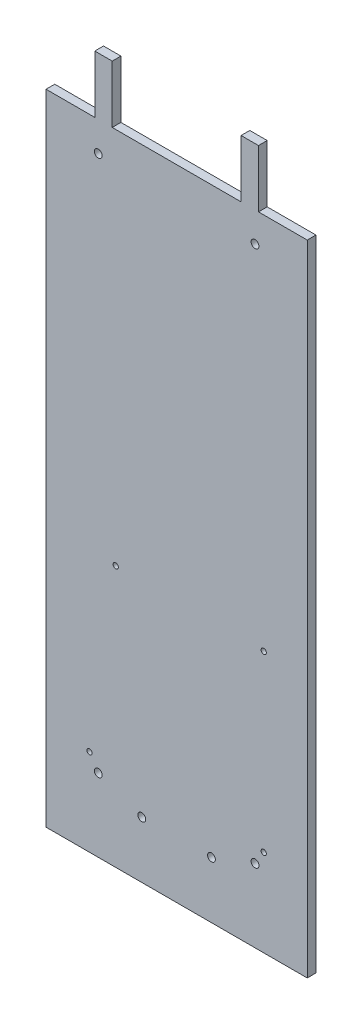
ISO-10303-21;
HEADER;
FILE_DESCRIPTION(('STEP AP214'),'2;1');
FILE_NAME('part.step','',(''),(''),'','','');
FILE_SCHEMA(('AUTOMOTIVE_DESIGN { 1 0 10303 214 1 1 1 1 }'));
ENDSEC;
DATA;
#1=APPLICATION_CONTEXT('core data for automotive mechanical design processes');
#2=APPLICATION_PROTOCOL_DEFINITION('international standard','automotive_design',2000,#1);
#3=PRODUCT_CONTEXT('',#1,'mechanical');
#4=PRODUCT('Part','Part','',(#3));
#5=PRODUCT_RELATED_PRODUCT_CATEGORY('part','',(#4));
#6=PRODUCT_DEFINITION_FORMATION('','',#4);
#7=PRODUCT_DEFINITION_CONTEXT('part definition',#1,'design');
#8=PRODUCT_DEFINITION('design','',#6,#7);
#9=PRODUCT_DEFINITION_SHAPE('','',#8);
#10=(LENGTH_UNIT() NAMED_UNIT(*) SI_UNIT(.MILLI.,.METRE.));
#11=(NAMED_UNIT(*) PLANE_ANGLE_UNIT() SI_UNIT($,.RADIAN.));
#12=(NAMED_UNIT(*) SI_UNIT($,.STERADIAN.) SOLID_ANGLE_UNIT());
#13=UNCERTAINTY_MEASURE_WITH_UNIT(LENGTH_MEASURE(1.E-05),#10,'distance_accuracy_value','');
#14=(GEOMETRIC_REPRESENTATION_CONTEXT(3) GLOBAL_UNCERTAINTY_ASSIGNED_CONTEXT((#13)) GLOBAL_UNIT_ASSIGNED_CONTEXT((#10,
#11,#12)) REPRESENTATION_CONTEXT('',''));
#15=CARTESIAN_POINT('',(0.,0.,0.));
#16=DIRECTION('',(0.,0.,1.));
#17=DIRECTION('',(1.,0.,0.));
#18=AXIS2_PLACEMENT_3D('',#15,#16,#17);
#19=CARTESIAN_POINT('',(0.,0.,5.));
#20=DIRECTION('',(0.,0.,1.));
#21=DIRECTION('',(1.,0.,0.));
#22=AXIS2_PLACEMENT_3D('',#19,#20,#21);
#23=PLANE('',#22);
#24=CARTESIAN_POINT('',(55.,32.5,5.));
#25=DIRECTION('',(0.,0.,1.));
#26=DIRECTION('',(1.,0.,0.));
#27=AXIS2_PLACEMENT_3D('',#24,#25,#26);
#28=CIRCLE('',#27,2.25);
#29=CARTESIAN_POINT('',(57.25,32.5,5.));
#30=VERTEX_POINT('',#29);
#31=EDGE_CURVE('E321',#30,#30,#28,.T.);
#32=ORIENTED_EDGE('',*,*,#31,.F.);
#33=EDGE_LOOP('',(#32));
#34=FACE_BOUND('',#33,.T.);
#35=CARTESIAN_POINT('',(40.,150.,5.));
#36=DIRECTION('',(0.,0.,1.));
#37=DIRECTION('',(1.,0.,0.));
#38=AXIS2_PLACEMENT_3D('',#35,#36,#37);
#39=CIRCLE('',#38,1.5);
#40=CARTESIAN_POINT('',(41.5,150.,5.));
#41=VERTEX_POINT('',#40);
#42=EDGE_CURVE('E333',#41,#41,#39,.T.);
#43=ORIENTED_EDGE('',*,*,#42,.F.);
#44=EDGE_LOOP('',(#43));
#45=FACE_BOUND('',#44,.T.);
#46=CARTESIAN_POINT('',(30.,350.,5.));
#47=DIRECTION('',(0.,0.,1.));
#48=DIRECTION('',(1.,0.,0.));
#49=AXIS2_PLACEMENT_3D('',#46,#47,#48);
#50=CIRCLE('',#49,2.25000000000002);
#51=CARTESIAN_POINT('',(32.25,350.,5.));
#52=VERTEX_POINT('',#51);
#53=EDGE_CURVE('E345',#52,#52,#50,.T.);
#54=ORIENTED_EDGE('',*,*,#53,.F.);
#55=EDGE_LOOP('',(#54));
#56=FACE_BOUND('',#55,.T.);
#57=CARTESIAN_POINT('',(25.,50.,5.));
#58=DIRECTION('',(0.,0.,1.));
#59=DIRECTION('',(1.,0.,0.));
#60=AXIS2_PLACEMENT_3D('',#57,#58,#59);
#61=CIRCLE('',#60,1.5);
#62=CARTESIAN_POINT('',(26.5,50.,5.));
#63=VERTEX_POINT('',#62);
#64=EDGE_CURVE('E357',#63,#63,#61,.T.);
#65=ORIENTED_EDGE('',*,*,#64,.F.);
#66=EDGE_LOOP('',(#65));
#67=FACE_BOUND('',#66,.T.);
#68=CARTESIAN_POINT('',(30.,42.,5.));
#69=DIRECTION('',(0.,0.,1.));
#70=DIRECTION('',(1.,0.,0.));
#71=AXIS2_PLACEMENT_3D('',#68,#69,#70);
#72=CIRCLE('',#71,2.25000000000002);
#73=CARTESIAN_POINT('',(32.2500000000001,42.,5.));
#74=VERTEX_POINT('',#73);
#75=EDGE_CURVE('E164',#74,#74,#72,.T.);
#76=ORIENTED_EDGE('',*,*,#75,.F.);
#77=EDGE_LOOP('',(#76));
#78=FACE_BOUND('',#77,.T.);
#79=DIRECTION('',(0.,-1.,0.));
#80=VECTOR('',#79,1.);
#81=CARTESIAN_POINT('',(0.,0.,5.));
#82=LINE('',#81,#80);
#83=CARTESIAN_POINT('',(0.,367.,5.));
#84=VERTEX_POINT('',#83);
#85=CARTESIAN_POINT('',(0.,0.,5.));
#86=VERTEX_POINT('',#85);
#87=EDGE_CURVE('E184',#84,#86,#82,.T.);
#88=ORIENTED_EDGE('',*,*,#87,.T.);
#89=DIRECTION('',(1.,0.,0.));
#90=VECTOR('',#89,1.);
#91=CARTESIAN_POINT('',(0.,0.,5.));
#92=LINE('',#91,#90);
#93=CARTESIAN_POINT('',(150.,0.,5.));
#94=VERTEX_POINT('',#93);
#95=EDGE_CURVE('E111',#86,#94,#92,.T.);
#96=ORIENTED_EDGE('',*,*,#95,.T.);
#97=DIRECTION('',(0.,1.,0.));
#98=VECTOR('',#97,1.);
#99=CARTESIAN_POINT('',(150.,0.,5.));
#100=LINE('',#99,#98);
#101=CARTESIAN_POINT('',(150.,367.,5.));
#102=VERTEX_POINT('',#101);
#103=EDGE_CURVE('E211',#94,#102,#100,.T.);
#104=ORIENTED_EDGE('',*,*,#103,.T.);
#105=DIRECTION('',(-1.,0.,0.));
#106=VECTOR('',#105,1.);
#107=CARTESIAN_POINT('',(122.,367.,5.));
#108=LINE('',#107,#106);
#109=CARTESIAN_POINT('',(122.,367.,5.));
#110=VERTEX_POINT('',#109);
#111=EDGE_CURVE('E230',#102,#110,#108,.T.);
#112=ORIENTED_EDGE('',*,*,#111,.T.);
#113=DIRECTION('',(0.,1.,0.));
#114=VECTOR('',#113,1.);
#115=CARTESIAN_POINT('',(122.,400.,5.));
#116=LINE('',#115,#114);
#117=CARTESIAN_POINT('',(122.,400.,5.));
#118=VERTEX_POINT('',#117);
#119=EDGE_CURVE('E227',#110,#118,#116,.T.);
#120=ORIENTED_EDGE('',*,*,#119,.T.);
#121=DIRECTION('',(-1.,0.,0.));
#122=VECTOR('',#121,1.);
#123=CARTESIAN_POINT('',(112.,400.,5.));
#124=LINE('',#123,#122);
#125=CARTESIAN_POINT('',(112.,400.,5.));
#126=VERTEX_POINT('',#125);
#127=EDGE_CURVE('E229',#118,#126,#124,.T.);
#128=ORIENTED_EDGE('',*,*,#127,.T.);
#129=DIRECTION('',(0.,-1.,0.));
#130=VECTOR('',#129,1.);
#131=CARTESIAN_POINT('',(112.,367.,5.));
#132=LINE('',#131,#130);
#133=CARTESIAN_POINT('',(112.,367.,5.));
#134=VERTEX_POINT('',#133);
#135=EDGE_CURVE('E232',#126,#134,#132,.T.);
#136=ORIENTED_EDGE('',*,*,#135,.T.);
#137=DIRECTION('',(-1.,0.,0.));
#138=VECTOR('',#137,1.);
#139=CARTESIAN_POINT('',(75.,367.,5.));
#140=LINE('',#139,#138);
#141=CARTESIAN_POINT('',(38.,367.,5.));
#142=VERTEX_POINT('',#141);
#143=EDGE_CURVE('E238',#134,#142,#140,.T.);
#144=ORIENTED_EDGE('',*,*,#143,.T.);
#145=DIRECTION('',(0.,1.,0.));
#146=VECTOR('',#145,1.);
#147=CARTESIAN_POINT('',(38.,400.,5.));
#148=LINE('',#147,#146);
#149=CARTESIAN_POINT('',(38.,400.,5.));
#150=VERTEX_POINT('',#149);
#151=EDGE_CURVE('E142',#142,#150,#148,.T.);
#152=ORIENTED_EDGE('',*,*,#151,.T.);
#153=DIRECTION('',(-1.,0.,0.));
#154=VECTOR('',#153,1.);
#155=CARTESIAN_POINT('',(28.,400.,5.));
#156=LINE('',#155,#154);
#157=CARTESIAN_POINT('',(28.,400.,5.));
#158=VERTEX_POINT('',#157);
#159=EDGE_CURVE('E136',#150,#158,#156,.T.);
#160=ORIENTED_EDGE('',*,*,#159,.T.);
#161=DIRECTION('',(0.,-1.,0.));
#162=VECTOR('',#161,1.);
#163=CARTESIAN_POINT('',(28.,400.,5.));
#164=LINE('',#163,#162);
#165=CARTESIAN_POINT('',(28.,367.,5.));
#166=VERTEX_POINT('',#165);
#167=EDGE_CURVE('E140',#158,#166,#164,.T.);
#168=ORIENTED_EDGE('',*,*,#167,.T.);
#169=DIRECTION('',(-1.,0.,0.));
#170=VECTOR('',#169,1.);
#171=CARTESIAN_POINT('',(28.,367.,5.));
#172=LINE('',#171,#170);
#173=EDGE_CURVE('E56',#166,#84,#172,.T.);
#174=ORIENTED_EDGE('',*,*,#173,.T.);
#175=EDGE_LOOP('',(#88,#96,#104,#112,#120,#128,#136,#144,#152,#160,#168,#174));
#176=FACE_BOUND('',#175,.T.);
#177=CARTESIAN_POINT('',(120.,42.,5.));
#178=DIRECTION('',(0.,0.,1.));
#179=DIRECTION('',(1.,0.,0.));
#180=AXIS2_PLACEMENT_3D('',#177,#178,#179);
#181=CIRCLE('',#180,2.25);
#182=CARTESIAN_POINT('',(122.25,42.,5.));
#183=VERTEX_POINT('',#182);
#184=EDGE_CURVE('E363',#183,#183,#181,.T.);
#185=ORIENTED_EDGE('',*,*,#184,.F.);
#186=EDGE_LOOP('',(#185));
#187=FACE_BOUND('',#186,.T.);
#188=CARTESIAN_POINT('',(125.,50.,5.));
#189=DIRECTION('',(0.,0.,1.));
#190=DIRECTION('',(1.,0.,0.));
#191=AXIS2_PLACEMENT_3D('',#188,#189,#190);
#192=CIRCLE('',#191,1.5);
#193=CARTESIAN_POINT('',(126.5,50.,5.));
#194=VERTEX_POINT('',#193);
#195=EDGE_CURVE('E351',#194,#194,#192,.T.);
#196=ORIENTED_EDGE('',*,*,#195,.F.);
#197=EDGE_LOOP('',(#196));
#198=FACE_BOUND('',#197,.T.);
#199=CARTESIAN_POINT('',(120.,350.,5.));
#200=DIRECTION('',(0.,0.,1.));
#201=DIRECTION('',(1.,0.,0.));
#202=AXIS2_PLACEMENT_3D('',#199,#200,#201);
#203=CIRCLE('',#202,2.25);
#204=CARTESIAN_POINT('',(122.25,350.,5.));
#205=VERTEX_POINT('',#204);
#206=EDGE_CURVE('E339',#205,#205,#203,.T.);
#207=ORIENTED_EDGE('',*,*,#206,.F.);
#208=EDGE_LOOP('',(#207));
#209=FACE_BOUND('',#208,.T.);
#210=CARTESIAN_POINT('',(125.,150.,5.));
#211=DIRECTION('',(0.,0.,1.));
#212=DIRECTION('',(1.,0.,0.));
#213=AXIS2_PLACEMENT_3D('',#210,#211,#212);
#214=CIRCLE('',#213,1.5);
#215=CARTESIAN_POINT('',(126.5,150.,5.));
#216=VERTEX_POINT('',#215);
#217=EDGE_CURVE('E327',#216,#216,#214,.T.);
#218=ORIENTED_EDGE('',*,*,#217,.F.);
#219=EDGE_LOOP('',(#218));
#220=FACE_BOUND('',#219,.T.);
#221=CARTESIAN_POINT('',(95.,32.5,5.));
#222=DIRECTION('',(0.,0.,1.));
#223=DIRECTION('',(1.,0.,0.));
#224=AXIS2_PLACEMENT_3D('',#221,#222,#223);
#225=CIRCLE('',#224,2.25);
#226=CARTESIAN_POINT('',(97.25,32.5,5.));
#227=VERTEX_POINT('',#226);
#228=EDGE_CURVE('E312',#227,#227,#225,.T.);
#229=ORIENTED_EDGE('',*,*,#228,.F.);
#230=EDGE_LOOP('',(#229));
#231=FACE_BOUND('',#230,.T.);
#232=ADVANCED_FACE('F39',(#34,#45,#56,#67,#78,#176,#187,#198,#209,#220,#231),#23,.T.);
#233=CARTESIAN_POINT('',(0.,0.,0.));
#234=DIRECTION('',(0.,0.,1.));
#235=DIRECTION('',(1.,0.,0.));
#236=AXIS2_PLACEMENT_3D('',#233,#234,#235);
#237=PLANE('',#236);
#238=DIRECTION('',(0.,-1.,0.));
#239=VECTOR('',#238,1.);
#240=CARTESIAN_POINT('',(0.,0.,0.));
#241=LINE('',#240,#239);
#242=CARTESIAN_POINT('',(0.,367.,0.));
#243=VERTEX_POINT('',#242);
#244=CARTESIAN_POINT('',(0.,0.,0.));
#245=VERTEX_POINT('',#244);
#246=EDGE_CURVE('E160',#243,#245,#241,.T.);
#247=ORIENTED_EDGE('',*,*,#246,.F.);
#248=DIRECTION('',(-1.,0.,0.));
#249=VECTOR('',#248,1.);
#250=CARTESIAN_POINT('',(28.,367.,0.));
#251=LINE('',#250,#249);
#252=CARTESIAN_POINT('',(28.,367.,0.));
#253=VERTEX_POINT('',#252);
#254=EDGE_CURVE('E103',#253,#243,#251,.T.);
#255=ORIENTED_EDGE('',*,*,#254,.F.);
#256=DIRECTION('',(0.,-1.,0.));
#257=VECTOR('',#256,1.);
#258=CARTESIAN_POINT('',(28.,400.,0.));
#259=LINE('',#258,#257);
#260=CARTESIAN_POINT('',(28.,400.,0.));
#261=VERTEX_POINT('',#260);
#262=EDGE_CURVE('E97',#261,#253,#259,.T.);
#263=ORIENTED_EDGE('',*,*,#262,.F.);
#264=DIRECTION('',(-1.,0.,0.));
#265=VECTOR('',#264,1.);
#266=CARTESIAN_POINT('',(28.,400.,0.));
#267=LINE('',#266,#265);
#268=CARTESIAN_POINT('',(38.,400.,0.));
#269=VERTEX_POINT('',#268);
#270=EDGE_CURVE('E150',#269,#261,#267,.T.);
#271=ORIENTED_EDGE('',*,*,#270,.F.);
#272=DIRECTION('',(0.,1.,0.));
#273=VECTOR('',#272,1.);
#274=CARTESIAN_POINT('',(38.,400.,0.));
#275=LINE('',#274,#273);
#276=CARTESIAN_POINT('',(38.,367.,0.));
#277=VERTEX_POINT('',#276);
#278=EDGE_CURVE('E179',#277,#269,#275,.T.);
#279=ORIENTED_EDGE('',*,*,#278,.F.);
#280=DIRECTION('',(-1.,0.,0.));
#281=VECTOR('',#280,1.);
#282=CARTESIAN_POINT('',(38.,367.,0.));
#283=LINE('',#282,#281);
#284=CARTESIAN_POINT('',(112.,367.,0.));
#285=VERTEX_POINT('',#284);
#286=EDGE_CURVE('E177',#285,#277,#283,.T.);
#287=ORIENTED_EDGE('',*,*,#286,.F.);
#288=DIRECTION('',(0.,-1.,0.));
#289=VECTOR('',#288,1.);
#290=CARTESIAN_POINT('',(112.,367.,0.));
#291=LINE('',#290,#289);
#292=CARTESIAN_POINT('',(112.,400.,0.));
#293=VERTEX_POINT('',#292);
#294=EDGE_CURVE('E174',#293,#285,#291,.T.);
#295=ORIENTED_EDGE('',*,*,#294,.F.);
#296=DIRECTION('',(-1.,0.,0.));
#297=VECTOR('',#296,1.);
#298=CARTESIAN_POINT('',(112.,400.,0.));
#299=LINE('',#298,#297);
#300=CARTESIAN_POINT('',(122.,400.,0.));
#301=VERTEX_POINT('',#300);
#302=EDGE_CURVE('E172',#301,#293,#299,.T.);
#303=ORIENTED_EDGE('',*,*,#302,.F.);
#304=DIRECTION('',(0.,1.,0.));
#305=VECTOR('',#304,1.);
#306=CARTESIAN_POINT('',(122.,400.,0.));
#307=LINE('',#306,#305);
#308=CARTESIAN_POINT('',(122.,367.,0.));
#309=VERTEX_POINT('',#308);
#310=EDGE_CURVE('E170',#309,#301,#307,.T.);
#311=ORIENTED_EDGE('',*,*,#310,.F.);
#312=DIRECTION('',(-1.,0.,0.));
#313=VECTOR('',#312,1.);
#314=CARTESIAN_POINT('',(122.,367.,0.));
#315=LINE('',#314,#313);
#316=CARTESIAN_POINT('',(150.,367.,0.));
#317=VERTEX_POINT('',#316);
#318=EDGE_CURVE('E168',#317,#309,#315,.T.);
#319=ORIENTED_EDGE('',*,*,#318,.F.);
#320=DIRECTION('',(0.,1.,0.));
#321=VECTOR('',#320,1.);
#322=CARTESIAN_POINT('',(150.,0.,0.));
#323=LINE('',#322,#321);
#324=CARTESIAN_POINT('',(150.,0.,0.));
#325=VERTEX_POINT('',#324);
#326=EDGE_CURVE('E166',#325,#317,#323,.T.);
#327=ORIENTED_EDGE('',*,*,#326,.F.);
#328=DIRECTION('',(1.,0.,0.));
#329=VECTOR('',#328,1.);
#330=CARTESIAN_POINT('',(0.,0.,0.));
#331=LINE('',#330,#329);
#332=EDGE_CURVE('E163',#245,#325,#331,.T.);
#333=ORIENTED_EDGE('',*,*,#332,.F.);
#334=EDGE_LOOP('',(#247,#255,#263,#271,#279,#287,#295,#303,#311,#319,#327,#333));
#335=FACE_BOUND('',#334,.T.);
#336=CARTESIAN_POINT('',(30.,42.,0.));
#337=DIRECTION('',(0.,0.,1.));
#338=DIRECTION('',(1.,0.,0.));
#339=AXIS2_PLACEMENT_3D('',#336,#337,#338);
#340=CIRCLE('',#339,2.25000000000002);
#341=CARTESIAN_POINT('',(32.2500000000001,42.,0.));
#342=VERTEX_POINT('',#341);
#343=EDGE_CURVE('E366',#342,#342,#340,.T.);
#344=ORIENTED_EDGE('',*,*,#343,.T.);
#345=EDGE_LOOP('',(#344));
#346=FACE_BOUND('',#345,.T.);
#347=CARTESIAN_POINT('',(120.,42.,0.));
#348=DIRECTION('',(0.,0.,1.));
#349=DIRECTION('',(1.,0.,0.));
#350=AXIS2_PLACEMENT_3D('',#347,#348,#349);
#351=CIRCLE('',#350,2.25);
#352=CARTESIAN_POINT('',(122.25,42.,0.));
#353=VERTEX_POINT('',#352);
#354=EDGE_CURVE('E360',#353,#353,#351,.T.);
#355=ORIENTED_EDGE('',*,*,#354,.T.);
#356=EDGE_LOOP('',(#355));
#357=FACE_BOUND('',#356,.T.);
#358=CARTESIAN_POINT('',(25.,50.,0.));
#359=DIRECTION('',(0.,0.,1.));
#360=DIRECTION('',(1.,0.,0.));
#361=AXIS2_PLACEMENT_3D('',#358,#359,#360);
#362=CIRCLE('',#361,1.5);
#363=CARTESIAN_POINT('',(26.5,50.,0.));
#364=VERTEX_POINT('',#363);
#365=EDGE_CURVE('E354',#364,#364,#362,.T.);
#366=ORIENTED_EDGE('',*,*,#365,.T.);
#367=EDGE_LOOP('',(#366));
#368=FACE_BOUND('',#367,.T.);
#369=CARTESIAN_POINT('',(125.,50.,0.));
#370=DIRECTION('',(0.,0.,1.));
#371=DIRECTION('',(1.,0.,0.));
#372=AXIS2_PLACEMENT_3D('',#369,#370,#371);
#373=CIRCLE('',#372,1.5);
#374=CARTESIAN_POINT('',(126.5,50.,0.));
#375=VERTEX_POINT('',#374);
#376=EDGE_CURVE('E348',#375,#375,#373,.T.);
#377=ORIENTED_EDGE('',*,*,#376,.T.);
#378=EDGE_LOOP('',(#377));
#379=FACE_BOUND('',#378,.T.);
#380=CARTESIAN_POINT('',(30.,350.,0.));
#381=DIRECTION('',(0.,0.,1.));
#382=DIRECTION('',(1.,0.,0.));
#383=AXIS2_PLACEMENT_3D('',#380,#381,#382);
#384=CIRCLE('',#383,2.25000000000002);
#385=CARTESIAN_POINT('',(32.25,350.,0.));
#386=VERTEX_POINT('',#385);
#387=EDGE_CURVE('E342',#386,#386,#384,.T.);
#388=ORIENTED_EDGE('',*,*,#387,.T.);
#389=EDGE_LOOP('',(#388));
#390=FACE_BOUND('',#389,.T.);
#391=CARTESIAN_POINT('',(120.,350.,0.));
#392=DIRECTION('',(0.,0.,1.));
#393=DIRECTION('',(1.,0.,0.));
#394=AXIS2_PLACEMENT_3D('',#391,#392,#393);
#395=CIRCLE('',#394,2.25);
#396=CARTESIAN_POINT('',(122.25,350.,0.));
#397=VERTEX_POINT('',#396);
#398=EDGE_CURVE('E336',#397,#397,#395,.T.);
#399=ORIENTED_EDGE('',*,*,#398,.T.);
#400=EDGE_LOOP('',(#399));
#401=FACE_BOUND('',#400,.T.);
#402=CARTESIAN_POINT('',(40.,150.,0.));
#403=DIRECTION('',(0.,0.,1.));
#404=DIRECTION('',(1.,0.,0.));
#405=AXIS2_PLACEMENT_3D('',#402,#403,#404);
#406=CIRCLE('',#405,1.5);
#407=CARTESIAN_POINT('',(41.5,150.,0.));
#408=VERTEX_POINT('',#407);
#409=EDGE_CURVE('E330',#408,#408,#406,.T.);
#410=ORIENTED_EDGE('',*,*,#409,.T.);
#411=EDGE_LOOP('',(#410));
#412=FACE_BOUND('',#411,.T.);
#413=CARTESIAN_POINT('',(125.,150.,0.));
#414=DIRECTION('',(0.,0.,1.));
#415=DIRECTION('',(1.,0.,0.));
#416=AXIS2_PLACEMENT_3D('',#413,#414,#415);
#417=CIRCLE('',#416,1.5);
#418=CARTESIAN_POINT('',(126.5,150.,0.));
#419=VERTEX_POINT('',#418);
#420=EDGE_CURVE('E324',#419,#419,#417,.T.);
#421=ORIENTED_EDGE('',*,*,#420,.T.);
#422=EDGE_LOOP('',(#421));
#423=FACE_BOUND('',#422,.T.);
#424=CARTESIAN_POINT('',(55.,32.5,0.));
#425=DIRECTION('',(0.,0.,1.));
#426=DIRECTION('',(1.,0.,0.));
#427=AXIS2_PLACEMENT_3D('',#424,#425,#426);
#428=CIRCLE('',#427,2.25);
#429=CARTESIAN_POINT('',(57.25,32.5,0.));
#430=VERTEX_POINT('',#429);
#431=EDGE_CURVE('E318',#430,#430,#428,.T.);
#432=ORIENTED_EDGE('',*,*,#431,.T.);
#433=EDGE_LOOP('',(#432));
#434=FACE_BOUND('',#433,.T.);
#435=CARTESIAN_POINT('',(95.,32.5,0.));
#436=DIRECTION('',(0.,0.,1.));
#437=DIRECTION('',(1.,0.,0.));
#438=AXIS2_PLACEMENT_3D('',#435,#436,#437);
#439=CIRCLE('',#438,2.25);
#440=CARTESIAN_POINT('',(97.25,32.5,0.));
#441=VERTEX_POINT('',#440);
#442=EDGE_CURVE('E315',#441,#441,#439,.T.);
#443=ORIENTED_EDGE('',*,*,#442,.T.);
#444=EDGE_LOOP('',(#443));
#445=FACE_BOUND('',#444,.T.);
#446=ADVANCED_FACE('F215',(#335,#346,#357,#368,#379,#390,#401,#412,#423,#434,#445),#237,.F.);
#447=CARTESIAN_POINT('',(0.,0.,5.));
#448=DIRECTION('',(1.,0.,0.));
#449=DIRECTION('',(0.,0.,-1.));
#450=AXIS2_PLACEMENT_3D('',#447,#448,#449);
#451=PLANE('',#450);
#452=ORIENTED_EDGE('',*,*,#246,.T.);
#453=DIRECTION('',(0.,0.,-1.));
#454=VECTOR('',#453,1.);
#455=CARTESIAN_POINT('',(0.,0.,5.));
#456=LINE('',#455,#454);
#457=EDGE_CURVE('E11',#86,#245,#456,.T.);
#458=ORIENTED_EDGE('',*,*,#457,.F.);
#459=ORIENTED_EDGE('',*,*,#87,.F.);
#460=DIRECTION('',(0.,0.,-1.));
#461=VECTOR('',#460,1.);
#462=CARTESIAN_POINT('',(0.,367.,5.));
#463=LINE('',#462,#461);
#464=EDGE_CURVE('E156',#84,#243,#463,.T.);
#465=ORIENTED_EDGE('',*,*,#464,.T.);
#466=EDGE_LOOP('',(#452,#458,#459,#465));
#467=FACE_BOUND('',#466,.T.);
#468=ADVANCED_FACE('F41',(#467),#451,.F.);
#469=CARTESIAN_POINT('',(0.,0.,5.));
#470=DIRECTION('',(0.,1.,0.));
#471=DIRECTION('',(0.,0.,1.));
#472=AXIS2_PLACEMENT_3D('',#469,#470,#471);
#473=PLANE('',#472);
#474=ORIENTED_EDGE('',*,*,#332,.T.);
#475=DIRECTION('',(0.,0.,-1.));
#476=VECTOR('',#475,1.);
#477=CARTESIAN_POINT('',(150.,0.,5.));
#478=LINE('',#477,#476);
#479=EDGE_CURVE('E48',#94,#325,#478,.T.);
#480=ORIENTED_EDGE('',*,*,#479,.F.);
#481=ORIENTED_EDGE('',*,*,#95,.F.);
#482=ORIENTED_EDGE('',*,*,#457,.T.);
#483=EDGE_LOOP('',(#474,#480,#481,#482));
#484=FACE_BOUND('',#483,.T.);
#485=ADVANCED_FACE('F540',(#484),#473,.F.);
#486=CARTESIAN_POINT('',(150.,0.,5.));
#487=DIRECTION('',(-1.,0.,0.));
#488=DIRECTION('',(0.,0.,1.));
#489=AXIS2_PLACEMENT_3D('',#486,#487,#488);
#490=PLANE('',#489);
#491=ORIENTED_EDGE('',*,*,#326,.T.);
#492=DIRECTION('',(0.,0.,-1.));
#493=VECTOR('',#492,1.);
#494=CARTESIAN_POINT('',(150.,367.,5.));
#495=LINE('',#494,#493);
#496=EDGE_CURVE('E203',#102,#317,#495,.T.);
#497=ORIENTED_EDGE('',*,*,#496,.F.);
#498=ORIENTED_EDGE('',*,*,#103,.F.);
#499=ORIENTED_EDGE('',*,*,#479,.T.);
#500=EDGE_LOOP('',(#491,#497,#498,#499));
#501=FACE_BOUND('',#500,.T.);
#502=ADVANCED_FACE('F209',(#501),#490,.F.);
#503=CARTESIAN_POINT('',(122.,367.,5.));
#504=DIRECTION('',(0.,-1.,0.));
#505=DIRECTION('',(0.,0.,-1.));
#506=AXIS2_PLACEMENT_3D('',#503,#504,#505);
#507=PLANE('',#506);
#508=ORIENTED_EDGE('',*,*,#318,.T.);
#509=DIRECTION('',(0.,0.,-1.));
#510=VECTOR('',#509,1.);
#511=CARTESIAN_POINT('',(122.,367.,5.));
#512=LINE('',#511,#510);
#513=EDGE_CURVE('E200',#110,#309,#512,.T.);
#514=ORIENTED_EDGE('',*,*,#513,.F.);
#515=ORIENTED_EDGE('',*,*,#111,.F.);
#516=ORIENTED_EDGE('',*,*,#496,.T.);
#517=EDGE_LOOP('',(#508,#514,#515,#516));
#518=FACE_BOUND('',#517,.T.);
#519=ADVANCED_FACE('F221',(#518),#507,.F.);
#520=CARTESIAN_POINT('',(122.,400.,5.));
#521=DIRECTION('',(-1.,0.,0.));
#522=DIRECTION('',(0.,0.,1.));
#523=AXIS2_PLACEMENT_3D('',#520,#521,#522);
#524=PLANE('',#523);
#525=ORIENTED_EDGE('',*,*,#310,.T.);
#526=DIRECTION('',(0.,0.,-1.));
#527=VECTOR('',#526,1.);
#528=CARTESIAN_POINT('',(122.,400.,5.));
#529=LINE('',#528,#527);
#530=EDGE_CURVE('E197',#118,#301,#529,.T.);
#531=ORIENTED_EDGE('',*,*,#530,.F.);
#532=ORIENTED_EDGE('',*,*,#119,.F.);
#533=ORIENTED_EDGE('',*,*,#513,.T.);
#534=EDGE_LOOP('',(#525,#531,#532,#533));
#535=FACE_BOUND('',#534,.T.);
#536=ADVANCED_FACE('F225',(#535),#524,.F.);
#537=CARTESIAN_POINT('',(112.,400.,5.));
#538=DIRECTION('',(0.,-1.,0.));
#539=DIRECTION('',(0.,0.,-1.));
#540=AXIS2_PLACEMENT_3D('',#537,#538,#539);
#541=PLANE('',#540);
#542=ORIENTED_EDGE('',*,*,#302,.T.);
#543=DIRECTION('',(0.,0.,-1.));
#544=VECTOR('',#543,1.);
#545=CARTESIAN_POINT('',(112.,400.,5.));
#546=LINE('',#545,#544);
#547=EDGE_CURVE('E194',#126,#293,#546,.T.);
#548=ORIENTED_EDGE('',*,*,#547,.F.);
#549=ORIENTED_EDGE('',*,*,#127,.F.);
#550=ORIENTED_EDGE('',*,*,#530,.T.);
#551=EDGE_LOOP('',(#542,#548,#549,#550));
#552=FACE_BOUND('',#551,.T.);
#553=ADVANCED_FACE('F501',(#552),#541,.F.);
#554=CARTESIAN_POINT('',(112.,367.,5.));
#555=DIRECTION('',(1.,0.,0.));
#556=DIRECTION('',(0.,0.,-1.));
#557=AXIS2_PLACEMENT_3D('',#554,#555,#556);
#558=PLANE('',#557);
#559=ORIENTED_EDGE('',*,*,#294,.T.);
#560=DIRECTION('',(0.,0.,-1.));
#561=VECTOR('',#560,1.);
#562=CARTESIAN_POINT('',(112.,367.,5.));
#563=LINE('',#562,#561);
#564=EDGE_CURVE('E191',#134,#285,#563,.T.);
#565=ORIENTED_EDGE('',*,*,#564,.F.);
#566=ORIENTED_EDGE('',*,*,#135,.F.);
#567=ORIENTED_EDGE('',*,*,#547,.T.);
#568=EDGE_LOOP('',(#559,#565,#566,#567));
#569=FACE_BOUND('',#568,.T.);
#570=ADVANCED_FACE('F491',(#569),#558,.F.);
#571=CARTESIAN_POINT('',(38.,367.,5.));
#572=DIRECTION('',(0.,-1.,0.));
#573=DIRECTION('',(0.,0.,-1.));
#574=AXIS2_PLACEMENT_3D('',#571,#572,#573);
#575=PLANE('',#574);
#576=ORIENTED_EDGE('',*,*,#286,.T.);
#577=DIRECTION('',(0.,0.,-1.));
#578=VECTOR('',#577,1.);
#579=CARTESIAN_POINT('',(38.,367.,5.));
#580=LINE('',#579,#578);
#581=EDGE_CURVE('E188',#142,#277,#580,.T.);
#582=ORIENTED_EDGE('',*,*,#581,.F.);
#583=ORIENTED_EDGE('',*,*,#143,.F.);
#584=ORIENTED_EDGE('',*,*,#564,.T.);
#585=EDGE_LOOP('',(#576,#582,#583,#584));
#586=FACE_BOUND('',#585,.T.);
#587=ADVANCED_FACE('F244',(#586),#575,.F.);
#588=CARTESIAN_POINT('',(38.,400.,5.));
#589=DIRECTION('',(-1.,0.,0.));
#590=DIRECTION('',(0.,-1.,0.));
#591=AXIS2_PLACEMENT_3D('',#588,#589,#590);
#592=PLANE('',#591);
#593=ORIENTED_EDGE('',*,*,#278,.T.);
#594=DIRECTION('',(0.,0.,-1.));
#595=VECTOR('',#594,1.);
#596=CARTESIAN_POINT('',(38.,400.,5.));
#597=LINE('',#596,#595);
#598=EDGE_CURVE('E151',#150,#269,#597,.T.);
#599=ORIENTED_EDGE('',*,*,#598,.F.);
#600=ORIENTED_EDGE('',*,*,#151,.F.);
#601=ORIENTED_EDGE('',*,*,#581,.T.);
#602=EDGE_LOOP('',(#593,#599,#600,#601));
#603=FACE_BOUND('',#602,.T.);
#604=ADVANCED_FACE('F247',(#603),#592,.F.);
#605=CARTESIAN_POINT('',(28.,400.,5.));
#606=DIRECTION('',(0.,-1.,0.));
#607=DIRECTION('',(0.,0.,-1.));
#608=AXIS2_PLACEMENT_3D('',#605,#606,#607);
#609=PLANE('',#608);
#610=ORIENTED_EDGE('',*,*,#270,.T.);
#611=DIRECTION('',(0.,0.,-1.));
#612=VECTOR('',#611,1.);
#613=CARTESIAN_POINT('',(28.,400.,5.));
#614=LINE('',#613,#612);
#615=EDGE_CURVE('E147',#158,#261,#614,.T.);
#616=ORIENTED_EDGE('',*,*,#615,.F.);
#617=ORIENTED_EDGE('',*,*,#159,.F.);
#618=ORIENTED_EDGE('',*,*,#598,.T.);
#619=EDGE_LOOP('',(#610,#616,#617,#618));
#620=FACE_BOUND('',#619,.T.);
#621=ADVANCED_FACE('F148',(#620),#609,.F.);
#622=CARTESIAN_POINT('',(28.,400.,5.));
#623=DIRECTION('',(1.,0.,0.));
#624=DIRECTION('',(0.,1.,0.));
#625=AXIS2_PLACEMENT_3D('',#622,#623,#624);
#626=PLANE('',#625);
#627=ORIENTED_EDGE('',*,*,#262,.T.);
#628=DIRECTION('',(0.,0.,-1.));
#629=VECTOR('',#628,1.);
#630=CARTESIAN_POINT('',(28.,367.,5.));
#631=LINE('',#630,#629);
#632=EDGE_CURVE('E152',#166,#253,#631,.T.);
#633=ORIENTED_EDGE('',*,*,#632,.F.);
#634=ORIENTED_EDGE('',*,*,#167,.F.);
#635=ORIENTED_EDGE('',*,*,#615,.T.);
#636=EDGE_LOOP('',(#627,#633,#634,#635));
#637=FACE_BOUND('',#636,.T.);
#638=ADVANCED_FACE('F154',(#637),#626,.F.);
#639=CARTESIAN_POINT('',(28.,367.,5.));
#640=DIRECTION('',(0.,-1.,0.));
#641=DIRECTION('',(0.,0.,-1.));
#642=AXIS2_PLACEMENT_3D('',#639,#640,#641);
#643=PLANE('',#642);
#644=ORIENTED_EDGE('',*,*,#254,.T.);
#645=ORIENTED_EDGE('',*,*,#464,.F.);
#646=ORIENTED_EDGE('',*,*,#173,.F.);
#647=ORIENTED_EDGE('',*,*,#632,.T.);
#648=EDGE_LOOP('',(#644,#645,#646,#647));
#649=FACE_BOUND('',#648,.T.);
#650=ADVANCED_FACE('F251',(#649),#643,.F.);
#651=CARTESIAN_POINT('',(30.,42.,5.));
#652=DIRECTION('',(0.,0.,-1.));
#653=DIRECTION('',(-1.,0.,0.));
#654=AXIS2_PLACEMENT_3D('',#651,#652,#653);
#655=CYLINDRICAL_SURFACE('',#654,2.25000000000002);
#656=ORIENTED_EDGE('',*,*,#75,.T.);
#657=EDGE_LOOP('',(#656));
#658=FACE_BOUND('',#657,.T.);
#659=ORIENTED_EDGE('',*,*,#343,.F.);
#660=EDGE_LOOP('',(#659));
#661=FACE_BOUND('',#660,.T.);
#662=ADVANCED_FACE('F253',(#658,#661),#655,.F.);
#663=CARTESIAN_POINT('',(120.,42.,5.));
#664=DIRECTION('',(0.,0.,-1.));
#665=DIRECTION('',(-1.,0.,0.));
#666=AXIS2_PLACEMENT_3D('',#663,#664,#665);
#667=CYLINDRICAL_SURFACE('',#666,2.25);
#668=ORIENTED_EDGE('',*,*,#184,.T.);
#669=EDGE_LOOP('',(#668));
#670=FACE_BOUND('',#669,.T.);
#671=ORIENTED_EDGE('',*,*,#354,.F.);
#672=EDGE_LOOP('',(#671));
#673=FACE_BOUND('',#672,.T.);
#674=ADVANCED_FACE('F259',(#670,#673),#667,.F.);
#675=CARTESIAN_POINT('',(25.,50.,5.));
#676=DIRECTION('',(0.,0.,-1.));
#677=DIRECTION('',(-1.,0.,0.));
#678=AXIS2_PLACEMENT_3D('',#675,#676,#677);
#679=CYLINDRICAL_SURFACE('',#678,1.5);
#680=ORIENTED_EDGE('',*,*,#64,.T.);
#681=EDGE_LOOP('',(#680));
#682=FACE_BOUND('',#681,.T.);
#683=ORIENTED_EDGE('',*,*,#365,.F.);
#684=EDGE_LOOP('',(#683));
#685=FACE_BOUND('',#684,.T.);
#686=ADVANCED_FACE('F275',(#682,#685),#679,.F.);
#687=CARTESIAN_POINT('',(125.,50.,5.));
#688=DIRECTION('',(0.,0.,-1.));
#689=DIRECTION('',(-1.,0.,0.));
#690=AXIS2_PLACEMENT_3D('',#687,#688,#689);
#691=CYLINDRICAL_SURFACE('',#690,1.5);
#692=ORIENTED_EDGE('',*,*,#195,.T.);
#693=EDGE_LOOP('',(#692));
#694=FACE_BOUND('',#693,.T.);
#695=ORIENTED_EDGE('',*,*,#376,.F.);
#696=EDGE_LOOP('',(#695));
#697=FACE_BOUND('',#696,.T.);
#698=ADVANCED_FACE('F279',(#694,#697),#691,.F.);
#699=CARTESIAN_POINT('',(30.,350.,5.));
#700=DIRECTION('',(0.,0.,-1.));
#701=DIRECTION('',(-1.,0.,0.));
#702=AXIS2_PLACEMENT_3D('',#699,#700,#701);
#703=CYLINDRICAL_SURFACE('',#702,2.25000000000002);
#704=ORIENTED_EDGE('',*,*,#53,.T.);
#705=EDGE_LOOP('',(#704));
#706=FACE_BOUND('',#705,.T.);
#707=ORIENTED_EDGE('',*,*,#387,.F.);
#708=EDGE_LOOP('',(#707));
#709=FACE_BOUND('',#708,.T.);
#710=ADVANCED_FACE('F283',(#706,#709),#703,.F.);
#711=CARTESIAN_POINT('',(120.,350.,5.));
#712=DIRECTION('',(0.,0.,-1.));
#713=DIRECTION('',(-1.,0.,0.));
#714=AXIS2_PLACEMENT_3D('',#711,#712,#713);
#715=CYLINDRICAL_SURFACE('',#714,2.25);
#716=ORIENTED_EDGE('',*,*,#206,.T.);
#717=EDGE_LOOP('',(#716));
#718=FACE_BOUND('',#717,.T.);
#719=ORIENTED_EDGE('',*,*,#398,.F.);
#720=EDGE_LOOP('',(#719));
#721=FACE_BOUND('',#720,.T.);
#722=ADVANCED_FACE('F287',(#718,#721),#715,.F.);
#723=CARTESIAN_POINT('',(40.,150.,5.));
#724=DIRECTION('',(0.,0.,-1.));
#725=DIRECTION('',(-1.,0.,0.));
#726=AXIS2_PLACEMENT_3D('',#723,#724,#725);
#727=CYLINDRICAL_SURFACE('',#726,1.5);
#728=ORIENTED_EDGE('',*,*,#42,.T.);
#729=EDGE_LOOP('',(#728));
#730=FACE_BOUND('',#729,.T.);
#731=ORIENTED_EDGE('',*,*,#409,.F.);
#732=EDGE_LOOP('',(#731));
#733=FACE_BOUND('',#732,.T.);
#734=ADVANCED_FACE('F291',(#730,#733),#727,.F.);
#735=CARTESIAN_POINT('',(125.,150.,5.));
#736=DIRECTION('',(0.,0.,-1.));
#737=DIRECTION('',(-1.,0.,0.));
#738=AXIS2_PLACEMENT_3D('',#735,#736,#737);
#739=CYLINDRICAL_SURFACE('',#738,1.5);
#740=ORIENTED_EDGE('',*,*,#217,.T.);
#741=EDGE_LOOP('',(#740));
#742=FACE_BOUND('',#741,.T.);
#743=ORIENTED_EDGE('',*,*,#420,.F.);
#744=EDGE_LOOP('',(#743));
#745=FACE_BOUND('',#744,.T.);
#746=ADVANCED_FACE('F295',(#742,#745),#739,.F.);
#747=CARTESIAN_POINT('',(55.,32.5,5.));
#748=DIRECTION('',(0.,0.,-1.));
#749=DIRECTION('',(-1.,0.,0.));
#750=AXIS2_PLACEMENT_3D('',#747,#748,#749);
#751=CYLINDRICAL_SURFACE('',#750,2.25);
#752=ORIENTED_EDGE('',*,*,#31,.T.);
#753=EDGE_LOOP('',(#752));
#754=FACE_BOUND('',#753,.T.);
#755=ORIENTED_EDGE('',*,*,#431,.F.);
#756=EDGE_LOOP('',(#755));
#757=FACE_BOUND('',#756,.T.);
#758=ADVANCED_FACE('F299',(#754,#757),#751,.F.);
#759=CARTESIAN_POINT('',(95.,32.5,5.));
#760=DIRECTION('',(0.,0.,-1.));
#761=DIRECTION('',(-1.,0.,0.));
#762=AXIS2_PLACEMENT_3D('',#759,#760,#761);
#763=CYLINDRICAL_SURFACE('',#762,2.25);
#764=ORIENTED_EDGE('',*,*,#228,.T.);
#765=EDGE_LOOP('',(#764));
#766=FACE_BOUND('',#765,.T.);
#767=ORIENTED_EDGE('',*,*,#442,.F.);
#768=EDGE_LOOP('',(#767));
#769=FACE_BOUND('',#768,.T.);
#770=ADVANCED_FACE('F303',(#766,#769),#763,.F.);
#771=CLOSED_SHELL('',(#232,#446,#468,#485,#502,#519,#536,#553,#570,#587,#604,#621,#638,#650,
#662,#674,#686,#698,#710,#722,#734,#746,#758,#770));
#772=MANIFOLD_SOLID_BREP('B2',#771);
#773=ADVANCED_BREP_SHAPE_REPRESENTATION('',(#18,#772),#14);
#774=SHAPE_DEFINITION_REPRESENTATION(#9,#773);
ENDSEC;
END-ISO-10303-21;
